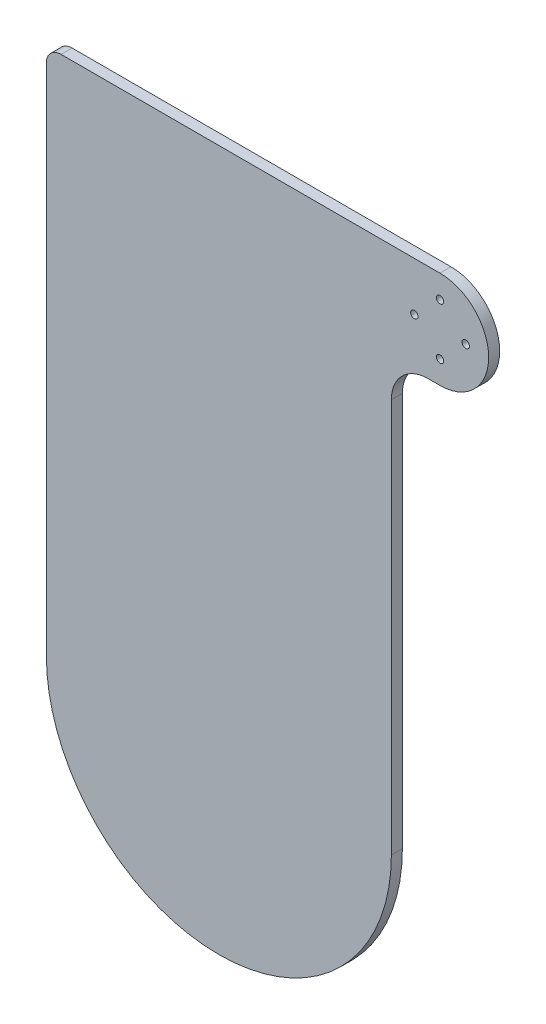
ISO-10303-21;
HEADER;
FILE_DESCRIPTION(('STEP AP214'),'2;1');
FILE_NAME('part.step','',(''),(''),'','','');
FILE_SCHEMA(('AUTOMOTIVE_DESIGN { 1 0 10303 214 1 1 1 1 }'));
ENDSEC;
DATA;
#1=APPLICATION_CONTEXT('core data for automotive mechanical design processes');
#2=APPLICATION_PROTOCOL_DEFINITION('international standard','automotive_design',2000,#1);
#3=PRODUCT_CONTEXT('',#1,'mechanical');
#4=PRODUCT('Part','Part','',(#3));
#5=PRODUCT_RELATED_PRODUCT_CATEGORY('part','',(#4));
#6=PRODUCT_DEFINITION_FORMATION('','',#4);
#7=PRODUCT_DEFINITION_CONTEXT('part definition',#1,'design');
#8=PRODUCT_DEFINITION('design','',#6,#7);
#9=PRODUCT_DEFINITION_SHAPE('','',#8);
#10=(LENGTH_UNIT() NAMED_UNIT(*) SI_UNIT(.MILLI.,.METRE.));
#11=(NAMED_UNIT(*) PLANE_ANGLE_UNIT() SI_UNIT($,.RADIAN.));
#12=(NAMED_UNIT(*) SI_UNIT($,.STERADIAN.) SOLID_ANGLE_UNIT());
#13=UNCERTAINTY_MEASURE_WITH_UNIT(LENGTH_MEASURE(1.E-05),#10,'distance_accuracy_value','');
#14=(GEOMETRIC_REPRESENTATION_CONTEXT(3) GLOBAL_UNCERTAINTY_ASSIGNED_CONTEXT((#13)) GLOBAL_UNIT_ASSIGNED_CONTEXT((#10,
#11,#12)) REPRESENTATION_CONTEXT('',''));
#15=CARTESIAN_POINT('',(0.,0.,0.));
#16=DIRECTION('',(0.,0.,1.));
#17=DIRECTION('',(1.,0.,0.));
#18=AXIS2_PLACEMENT_3D('',#15,#16,#17);
#19=CARTESIAN_POINT('',(-13.5687706879353,-43.6093853439674,3.));
#20=DIRECTION('',(0.,0.,-1.));
#21=DIRECTION('',(-1.,0.,0.));
#22=AXIS2_PLACEMENT_3D('',#19,#20,#21);
#23=CYLINDRICAL_SURFACE('',#22,47.);
#24=CARTESIAN_POINT('',(-13.5687706879353,-43.6093853439674,0.));
#25=DIRECTION('',(0.,0.,1.));
#26=DIRECTION('',(1.,0.,0.));
#27=AXIS2_PLACEMENT_3D('',#24,#25,#26);
#28=CIRCLE('',#27,47.);
#29=CARTESIAN_POINT('',(-60.5687706879353,-43.6093853439674,0.));
#30=VERTEX_POINT('',#29);
#31=CARTESIAN_POINT('',(33.4312293120647,-43.6093853439674,0.));
#32=VERTEX_POINT('',#31);
#33=EDGE_CURVE('E122',#30,#32,#28,.T.);
#34=ORIENTED_EDGE('',*,*,#33,.T.);
#35=DIRECTION('',(0.,0.,-1.));
#36=VECTOR('',#35,1.);
#37=CARTESIAN_POINT('',(33.4312293120647,-43.6093853439674,3.));
#38=LINE('',#37,#36);
#39=CARTESIAN_POINT('',(33.4312293120647,-43.6093853439674,3.));
#40=VERTEX_POINT('',#39);
#41=EDGE_CURVE('E103',#40,#32,#38,.T.);
#42=ORIENTED_EDGE('',*,*,#41,.F.);
#43=CARTESIAN_POINT('',(-13.5687706879353,-43.6093853439674,3.));
#44=DIRECTION('',(0.,0.,1.));
#45=DIRECTION('',(1.,0.,0.));
#46=AXIS2_PLACEMENT_3D('',#43,#44,#45);
#47=CIRCLE('',#46,47.);
#48=CARTESIAN_POINT('',(-60.5687706879353,-43.6093853439674,3.));
#49=VERTEX_POINT('',#48);
#50=EDGE_CURVE('E110',#49,#40,#47,.T.);
#51=ORIENTED_EDGE('',*,*,#50,.F.);
#52=DIRECTION('',(0.,0.,-1.));
#53=VECTOR('',#52,1.);
#54=CARTESIAN_POINT('',(-60.5687706879353,-43.6093853439674,3.));
#55=LINE('',#54,#53);
#56=EDGE_CURVE('E139',#49,#30,#55,.T.);
#57=ORIENTED_EDGE('',*,*,#56,.T.);
#58=EDGE_LOOP('',(#34,#42,#51,#57));
#59=FACE_BOUND('',#58,.T.);
#60=ADVANCED_FACE('F35',(#59),#23,.T.);
#61=CARTESIAN_POINT('',(33.4312293120647,-43.6093853439674,3.));
#62=DIRECTION('',(-1.,0.,0.));
#63=DIRECTION('',(0.,-1.,0.));
#64=AXIS2_PLACEMENT_3D('',#61,#62,#63);
#65=PLANE('',#64);
#66=DIRECTION('',(0.,1.,0.));
#67=VECTOR('',#66,1.);
#68=CARTESIAN_POINT('',(33.4312293120647,-43.6093853439674,0.));
#69=LINE('',#68,#67);
#70=CARTESIAN_POINT('',(33.4312293120647,63.7906146560326,0.));
#71=VERTEX_POINT('',#70);
#72=EDGE_CURVE('E151',#32,#71,#69,.T.);
#73=ORIENTED_EDGE('',*,*,#72,.T.);
#74=DIRECTION('',(0.,0.,-1.));
#75=VECTOR('',#74,1.);
#76=CARTESIAN_POINT('',(33.4312293120647,63.7906146560326,3.));
#77=LINE('',#76,#75);
#78=CARTESIAN_POINT('',(33.4312293120647,63.7906146560326,3.));
#79=VERTEX_POINT('',#78);
#80=EDGE_CURVE('E106',#79,#71,#77,.T.);
#81=ORIENTED_EDGE('',*,*,#80,.F.);
#82=DIRECTION('',(0.,1.,0.));
#83=VECTOR('',#82,1.);
#84=CARTESIAN_POINT('',(33.4312293120647,-43.6093853439674,3.));
#85=LINE('',#84,#83);
#86=EDGE_CURVE('E99',#40,#79,#85,.T.);
#87=ORIENTED_EDGE('',*,*,#86,.F.);
#88=ORIENTED_EDGE('',*,*,#41,.T.);
#89=EDGE_LOOP('',(#73,#81,#87,#88));
#90=FACE_BOUND('',#89,.T.);
#91=ADVANCED_FACE('F101',(#90),#65,.F.);
#92=CARTESIAN_POINT('',(43.4312293120647,63.7906146560326,3.));
#93=DIRECTION('',(0.,0.,-1.));
#94=DIRECTION('',(-1.,0.,0.));
#95=AXIS2_PLACEMENT_3D('',#92,#93,#94);
#96=CYLINDRICAL_SURFACE('',#95,9.99999999999999);
#97=CARTESIAN_POINT('',(43.4312293120647,63.7906146560326,0.));
#98=DIRECTION('',(0.,0.,-1.));
#99=DIRECTION('',(-1.,0.,0.));
#100=AXIS2_PLACEMENT_3D('',#97,#98,#99);
#101=CIRCLE('',#100,9.99999999999999);
#102=CARTESIAN_POINT('',(43.4312293120647,73.7906146560326,0.));
#103=VERTEX_POINT('',#102);
#104=EDGE_CURVE('E149',#71,#103,#101,.T.);
#105=ORIENTED_EDGE('',*,*,#104,.T.);
#106=DIRECTION('',(0.,0.,-1.));
#107=VECTOR('',#106,1.);
#108=CARTESIAN_POINT('',(43.4312293120647,73.7906146560326,3.));
#109=LINE('',#108,#107);
#110=CARTESIAN_POINT('',(43.4312293120647,73.7906146560326,3.));
#111=VERTEX_POINT('',#110);
#112=EDGE_CURVE('E127',#111,#103,#109,.T.);
#113=ORIENTED_EDGE('',*,*,#112,.F.);
#114=CARTESIAN_POINT('',(43.4312293120647,63.7906146560326,3.));
#115=DIRECTION('',(0.,0.,-1.));
#116=DIRECTION('',(-1.,0.,0.));
#117=AXIS2_PLACEMENT_3D('',#114,#115,#116);
#118=CIRCLE('',#117,9.99999999999999);
#119=EDGE_CURVE('E109',#79,#111,#118,.T.);
#120=ORIENTED_EDGE('',*,*,#119,.F.);
#121=ORIENTED_EDGE('',*,*,#80,.T.);
#122=EDGE_LOOP('',(#105,#113,#120,#121));
#123=FACE_BOUND('',#122,.T.);
#124=ADVANCED_FACE('F218',(#123),#96,.F.);
#125=CARTESIAN_POINT('',(46.6812293120647,73.7906146560326,3.));
#126=DIRECTION('',(0.,1.,0.));
#127=DIRECTION('',(0.,0.,1.));
#128=AXIS2_PLACEMENT_3D('',#125,#126,#127);
#129=PLANE('',#128);
#130=DIRECTION('',(1.,0.,0.));
#131=VECTOR('',#130,1.);
#132=CARTESIAN_POINT('',(46.6812293120647,73.7906146560326,0.));
#133=LINE('',#132,#131);
#134=CARTESIAN_POINT('',(46.6812293120647,73.7906146560326,0.));
#135=VERTEX_POINT('',#134);
#136=EDGE_CURVE('E147',#103,#135,#133,.T.);
#137=ORIENTED_EDGE('',*,*,#136,.T.);
#138=DIRECTION('',(0.,0.,-1.));
#139=VECTOR('',#138,1.);
#140=CARTESIAN_POINT('',(46.6812293120647,73.7906146560326,3.));
#141=LINE('',#140,#139);
#142=CARTESIAN_POINT('',(46.6812293120647,73.7906146560326,3.));
#143=VERTEX_POINT('',#142);
#144=EDGE_CURVE('E133',#143,#135,#141,.T.);
#145=ORIENTED_EDGE('',*,*,#144,.F.);
#146=DIRECTION('',(1.,0.,0.));
#147=VECTOR('',#146,1.);
#148=CARTESIAN_POINT('',(46.6812293120647,73.7906146560326,3.));
#149=LINE('',#148,#147);
#150=EDGE_CURVE('E160',#111,#143,#149,.T.);
#151=ORIENTED_EDGE('',*,*,#150,.F.);
#152=ORIENTED_EDGE('',*,*,#112,.T.);
#153=EDGE_LOOP('',(#137,#145,#151,#152));
#154=FACE_BOUND('',#153,.T.);
#155=ADVANCED_FACE('F214',(#154),#129,.F.);
#156=CARTESIAN_POINT('',(46.6812293120647,87.0406146560326,3.));
#157=DIRECTION('',(0.,0.,-1.));
#158=DIRECTION('',(-1.,0.,0.));
#159=AXIS2_PLACEMENT_3D('',#156,#157,#158);
#160=CYLINDRICAL_SURFACE('',#159,13.25);
#161=CARTESIAN_POINT('',(46.6812293120647,87.0406146560326,0.));
#162=DIRECTION('',(0.,0.,1.));
#163=DIRECTION('',(1.,0.,0.));
#164=AXIS2_PLACEMENT_3D('',#161,#162,#163);
#165=CIRCLE('',#164,13.25);
#166=CARTESIAN_POINT('',(46.6812293120647,100.290614656033,0.));
#167=VERTEX_POINT('',#166);
#168=EDGE_CURVE('E144',#135,#167,#165,.T.);
#169=ORIENTED_EDGE('',*,*,#168,.T.);
#170=DIRECTION('',(0.,0.,-1.));
#171=VECTOR('',#170,1.);
#172=CARTESIAN_POINT('',(46.6812293120647,100.290614656033,3.));
#173=LINE('',#172,#171);
#174=CARTESIAN_POINT('',(46.6812293120647,100.290614656033,3.));
#175=VERTEX_POINT('',#174);
#176=EDGE_CURVE('E136',#175,#167,#173,.T.);
#177=ORIENTED_EDGE('',*,*,#176,.F.);
#178=CARTESIAN_POINT('',(46.6812293120647,87.0406146560326,3.));
#179=DIRECTION('',(0.,0.,1.));
#180=DIRECTION('',(1.,0.,0.));
#181=AXIS2_PLACEMENT_3D('',#178,#179,#180);
#182=CIRCLE('',#181,13.25);
#183=EDGE_CURVE('E158',#143,#175,#182,.T.);
#184=ORIENTED_EDGE('',*,*,#183,.F.);
#185=ORIENTED_EDGE('',*,*,#144,.T.);
#186=EDGE_LOOP('',(#169,#177,#184,#185));
#187=FACE_BOUND('',#186,.T.);
#188=ADVANCED_FACE('F208',(#187),#160,.T.);
#189=CARTESIAN_POINT('',(33.4312293120647,100.290614656033,3.));
#190=DIRECTION('',(0.,-1.,0.));
#191=DIRECTION('',(0.,0.,-1.));
#192=AXIS2_PLACEMENT_3D('',#189,#190,#191);
#193=PLANE('',#192);
#194=DIRECTION('',(-1.,0.,0.));
#195=VECTOR('',#194,1.);
#196=CARTESIAN_POINT('',(33.4312293120647,100.290614656033,0.));
#197=LINE('',#196,#195);
#198=CARTESIAN_POINT('',(-56.5687706879353,100.290614656033,0.));
#199=VERTEX_POINT('',#198);
#200=EDGE_CURVE('E142',#167,#199,#197,.T.);
#201=ORIENTED_EDGE('',*,*,#200,.T.);
#202=DIRECTION('',(0.,0.,-1.));
#203=VECTOR('',#202,1.);
#204=CARTESIAN_POINT('',(-56.5687706879353,100.290614656033,3.));
#205=LINE('',#204,#203);
#206=CARTESIAN_POINT('',(-56.5687706879353,100.290614656032,3.));
#207=VERTEX_POINT('',#206);
#208=EDGE_CURVE('E43',#199,#207,#205,.F.);
#209=ORIENTED_EDGE('',*,*,#208,.T.);
#210=DIRECTION('',(-1.,0.,0.));
#211=VECTOR('',#210,1.);
#212=CARTESIAN_POINT('',(46.6812293120647,100.290614656033,3.));
#213=LINE('',#212,#211);
#214=EDGE_CURVE('E156',#175,#207,#213,.T.);
#215=ORIENTED_EDGE('',*,*,#214,.F.);
#216=ORIENTED_EDGE('',*,*,#176,.T.);
#217=EDGE_LOOP('',(#201,#209,#215,#216));
#218=FACE_BOUND('',#217,.T.);
#219=ADVANCED_FACE('F206',(#218),#193,.F.);
#220=CARTESIAN_POINT('',(-60.5687706879353,-43.6093853439674,3.));
#221=DIRECTION('',(1.,0.,0.));
#222=DIRECTION('',(0.,1.,0.));
#223=AXIS2_PLACEMENT_3D('',#220,#221,#222);
#224=PLANE('',#223);
#225=DIRECTION('',(0.,-1.,0.));
#226=VECTOR('',#225,1.);
#227=CARTESIAN_POINT('',(-60.5687706879353,-43.6093853439674,3.));
#228=LINE('',#227,#226);
#229=CARTESIAN_POINT('',(-60.5687706879353,96.2906146560326,3.));
#230=VERTEX_POINT('',#229);
#231=EDGE_CURVE('E115',#230,#49,#228,.T.);
#232=ORIENTED_EDGE('',*,*,#231,.F.);
#233=DIRECTION('',(0.,0.,-1.));
#234=VECTOR('',#233,1.);
#235=CARTESIAN_POINT('',(-60.5687706879353,96.2906146560326,3.));
#236=LINE('',#235,#234);
#237=CARTESIAN_POINT('',(-60.5687706879353,96.2906146560326,0.));
#238=VERTEX_POINT('',#237);
#239=EDGE_CURVE('E123',#230,#238,#236,.T.);
#240=ORIENTED_EDGE('',*,*,#239,.T.);
#241=DIRECTION('',(0.,-1.,0.));
#242=VECTOR('',#241,1.);
#243=CARTESIAN_POINT('',(-60.5687706879353,-43.6093853439674,0.));
#244=LINE('',#243,#242);
#245=EDGE_CURVE('E119',#238,#30,#244,.T.);
#246=ORIENTED_EDGE('',*,*,#245,.T.);
#247=ORIENTED_EDGE('',*,*,#56,.F.);
#248=EDGE_LOOP('',(#232,#240,#246,#247));
#249=FACE_BOUND('',#248,.T.);
#250=ADVANCED_FACE('F200',(#249),#224,.F.);
#251=CARTESIAN_POINT('',(-13.5687706879353,-43.6093853439674,3.));
#252=DIRECTION('',(0.,0.,1.));
#253=DIRECTION('',(1.,0.,0.));
#254=AXIS2_PLACEMENT_3D('',#251,#252,#253);
#255=PLANE('',#254);
#256=CARTESIAN_POINT('',(53.6812293120646,87.0406146560326,3.));
#257=DIRECTION('',(0.,0.,1.));
#258=DIRECTION('',(1.,0.,0.));
#259=AXIS2_PLACEMENT_3D('',#256,#257,#258);
#260=CIRCLE('',#259,0.999999999999998);
#261=CARTESIAN_POINT('',(54.6812293120646,87.0406146560326,3.));
#262=VERTEX_POINT('',#261);
#263=EDGE_CURVE('E180',#262,#262,#260,.T.);
#264=ORIENTED_EDGE('',*,*,#263,.F.);
#265=EDGE_LOOP('',(#264));
#266=FACE_BOUND('',#265,.T.);
#267=CARTESIAN_POINT('',(46.6812293120646,80.0406146560326,3.));
#268=DIRECTION('',(0.,0.,1.));
#269=DIRECTION('',(1.,0.,0.));
#270=AXIS2_PLACEMENT_3D('',#267,#268,#269);
#271=CIRCLE('',#270,0.999999999999998);
#272=CARTESIAN_POINT('',(47.6812293120646,80.0406146560326,3.));
#273=VERTEX_POINT('',#272);
#274=EDGE_CURVE('E174',#273,#273,#271,.T.);
#275=ORIENTED_EDGE('',*,*,#274,.F.);
#276=EDGE_LOOP('',(#275));
#277=FACE_BOUND('',#276,.T.);
#278=CARTESIAN_POINT('',(39.6812293120646,87.0406146560327,3.));
#279=DIRECTION('',(0.,0.,1.));
#280=DIRECTION('',(1.,0.,0.));
#281=AXIS2_PLACEMENT_3D('',#278,#279,#280);
#282=CIRCLE('',#281,0.999999999999998);
#283=CARTESIAN_POINT('',(40.6812293120646,87.0406146560327,3.));
#284=VERTEX_POINT('',#283);
#285=EDGE_CURVE('E168',#284,#284,#282,.T.);
#286=ORIENTED_EDGE('',*,*,#285,.F.);
#287=EDGE_LOOP('',(#286));
#288=FACE_BOUND('',#287,.T.);
#289=CARTESIAN_POINT('',(46.6812293120647,94.0406146560326,3.));
#290=DIRECTION('',(0.,0.,1.));
#291=DIRECTION('',(1.,0.,0.));
#292=AXIS2_PLACEMENT_3D('',#289,#290,#291);
#293=CIRCLE('',#292,0.999999999999998);
#294=CARTESIAN_POINT('',(47.6812293120647,94.0406146560326,3.));
#295=VERTEX_POINT('',#294);
#296=EDGE_CURVE('E154',#295,#295,#293,.T.);
#297=ORIENTED_EDGE('',*,*,#296,.F.);
#298=EDGE_LOOP('',(#297));
#299=FACE_BOUND('',#298,.T.);
#300=ORIENTED_EDGE('',*,*,#214,.T.);
#301=CARTESIAN_POINT('',(-56.5687706879353,96.2906146560326,3.));
#302=DIRECTION('',(0.,0.,1.));
#303=DIRECTION('',(1.,0.,0.));
#304=AXIS2_PLACEMENT_3D('',#301,#302,#303);
#305=CIRCLE('',#304,4.);
#306=EDGE_CURVE('E11',#207,#230,#305,.T.);
#307=ORIENTED_EDGE('',*,*,#306,.T.);
#308=ORIENTED_EDGE('',*,*,#231,.T.);
#309=ORIENTED_EDGE('',*,*,#50,.T.);
#310=ORIENTED_EDGE('',*,*,#86,.T.);
#311=ORIENTED_EDGE('',*,*,#119,.T.);
#312=ORIENTED_EDGE('',*,*,#150,.T.);
#313=ORIENTED_EDGE('',*,*,#183,.T.);
#314=EDGE_LOOP('',(#300,#307,#308,#309,#310,#311,#312,#313));
#315=FACE_BOUND('',#314,.T.);
#316=ADVANCED_FACE('F113',(#266,#277,#288,#299,#315),#255,.T.);
#317=CARTESIAN_POINT('',(-13.5687706879353,-43.6093853439674,0.));
#318=DIRECTION('',(0.,0.,1.));
#319=DIRECTION('',(1.,0.,0.));
#320=AXIS2_PLACEMENT_3D('',#317,#318,#319);
#321=PLANE('',#320);
#322=CARTESIAN_POINT('',(53.6812293120646,87.0406146560326,0.));
#323=DIRECTION('',(0.,0.,-1.));
#324=DIRECTION('',(-1.,0.,0.));
#325=AXIS2_PLACEMENT_3D('',#322,#323,#324);
#326=CIRCLE('',#325,0.999999999999998);
#327=CARTESIAN_POINT('',(52.6812293120646,87.0406146560326,0.));
#328=VERTEX_POINT('',#327);
#329=EDGE_CURVE('E183',#328,#328,#326,.T.);
#330=ORIENTED_EDGE('',*,*,#329,.F.);
#331=EDGE_LOOP('',(#330));
#332=FACE_BOUND('',#331,.T.);
#333=CARTESIAN_POINT('',(46.6812293120646,80.0406146560326,0.));
#334=DIRECTION('',(0.,0.,-1.));
#335=DIRECTION('',(-1.,0.,0.));
#336=AXIS2_PLACEMENT_3D('',#333,#334,#335);
#337=CIRCLE('',#336,0.999999999999998);
#338=CARTESIAN_POINT('',(45.6812293120646,80.0406146560326,0.));
#339=VERTEX_POINT('',#338);
#340=EDGE_CURVE('E177',#339,#339,#337,.T.);
#341=ORIENTED_EDGE('',*,*,#340,.F.);
#342=EDGE_LOOP('',(#341));
#343=FACE_BOUND('',#342,.T.);
#344=CARTESIAN_POINT('',(39.6812293120646,87.0406146560327,0.));
#345=DIRECTION('',(0.,0.,-1.));
#346=DIRECTION('',(-1.,0.,0.));
#347=AXIS2_PLACEMENT_3D('',#344,#345,#346);
#348=CIRCLE('',#347,0.999999999999998);
#349=CARTESIAN_POINT('',(38.6812293120646,87.0406146560327,0.));
#350=VERTEX_POINT('',#349);
#351=EDGE_CURVE('E171',#350,#350,#348,.T.);
#352=ORIENTED_EDGE('',*,*,#351,.F.);
#353=EDGE_LOOP('',(#352));
#354=FACE_BOUND('',#353,.T.);
#355=CARTESIAN_POINT('',(46.6812293120647,94.0406146560326,0.));
#356=DIRECTION('',(0.,0.,-1.));
#357=DIRECTION('',(-1.,0.,0.));
#358=AXIS2_PLACEMENT_3D('',#355,#356,#357);
#359=CIRCLE('',#358,0.999999999999998);
#360=CARTESIAN_POINT('',(45.6812293120647,94.0406146560326,0.));
#361=VERTEX_POINT('',#360);
#362=EDGE_CURVE('E165',#361,#361,#359,.T.);
#363=ORIENTED_EDGE('',*,*,#362,.F.);
#364=EDGE_LOOP('',(#363));
#365=FACE_BOUND('',#364,.T.);
#366=ORIENTED_EDGE('',*,*,#245,.F.);
#367=CARTESIAN_POINT('',(-56.5687706879353,96.2906146560326,0.));
#368=DIRECTION('',(0.,0.,1.));
#369=DIRECTION('',(1.,0.,0.));
#370=AXIS2_PLACEMENT_3D('',#367,#368,#369);
#371=CIRCLE('',#370,4.);
#372=EDGE_CURVE('E57',#238,#199,#371,.F.);
#373=ORIENTED_EDGE('',*,*,#372,.T.);
#374=ORIENTED_EDGE('',*,*,#200,.F.);
#375=ORIENTED_EDGE('',*,*,#168,.F.);
#376=ORIENTED_EDGE('',*,*,#136,.F.);
#377=ORIENTED_EDGE('',*,*,#104,.F.);
#378=ORIENTED_EDGE('',*,*,#72,.F.);
#379=ORIENTED_EDGE('',*,*,#33,.F.);
#380=EDGE_LOOP('',(#366,#373,#374,#375,#376,#377,#378,#379));
#381=FACE_BOUND('',#380,.T.);
#382=ADVANCED_FACE('F189',(#332,#343,#354,#365,#381),#321,.F.);
#383=CARTESIAN_POINT('',(46.6812293120647,94.0406146560326,10.));
#384=DIRECTION('',(0.,0.,-1.));
#385=DIRECTION('',(-1.,0.,0.));
#386=AXIS2_PLACEMENT_3D('',#383,#384,#385);
#387=CYLINDRICAL_SURFACE('',#386,0.999999999999998);
#388=ORIENTED_EDGE('',*,*,#296,.T.);
#389=EDGE_LOOP('',(#388));
#390=FACE_BOUND('',#389,.T.);
#391=ORIENTED_EDGE('',*,*,#362,.T.);
#392=EDGE_LOOP('',(#391));
#393=FACE_BOUND('',#392,.T.);
#394=ADVANCED_FACE('F192',(#390,#393),#387,.F.);
#395=CARTESIAN_POINT('',(39.6812293120646,87.0406146560327,10.));
#396=DIRECTION('',(0.,0.,-1.));
#397=DIRECTION('',(-1.,0.,0.));
#398=AXIS2_PLACEMENT_3D('',#395,#396,#397);
#399=CYLINDRICAL_SURFACE('',#398,0.999999999999998);
#400=ORIENTED_EDGE('',*,*,#285,.T.);
#401=EDGE_LOOP('',(#400));
#402=FACE_BOUND('',#401,.T.);
#403=ORIENTED_EDGE('',*,*,#351,.T.);
#404=EDGE_LOOP('',(#403));
#405=FACE_BOUND('',#404,.T.);
#406=ADVANCED_FACE('F263',(#402,#405),#399,.F.);
#407=CARTESIAN_POINT('',(46.6812293120646,80.0406146560326,10.));
#408=DIRECTION('',(0.,0.,-1.));
#409=DIRECTION('',(-1.,0.,0.));
#410=AXIS2_PLACEMENT_3D('',#407,#408,#409);
#411=CYLINDRICAL_SURFACE('',#410,0.999999999999998);
#412=ORIENTED_EDGE('',*,*,#274,.T.);
#413=EDGE_LOOP('',(#412));
#414=FACE_BOUND('',#413,.T.);
#415=ORIENTED_EDGE('',*,*,#340,.T.);
#416=EDGE_LOOP('',(#415));
#417=FACE_BOUND('',#416,.T.);
#418=ADVANCED_FACE('F275',(#414,#417),#411,.F.);
#419=CARTESIAN_POINT('',(53.6812293120646,87.0406146560326,10.));
#420=DIRECTION('',(0.,0.,-1.));
#421=DIRECTION('',(-1.,0.,0.));
#422=AXIS2_PLACEMENT_3D('',#419,#420,#421);
#423=CYLINDRICAL_SURFACE('',#422,0.999999999999998);
#424=ORIENTED_EDGE('',*,*,#263,.T.);
#425=EDGE_LOOP('',(#424));
#426=FACE_BOUND('',#425,.T.);
#427=ORIENTED_EDGE('',*,*,#329,.T.);
#428=EDGE_LOOP('',(#427));
#429=FACE_BOUND('',#428,.T.);
#430=ADVANCED_FACE('F187',(#426,#429),#423,.F.);
#431=CARTESIAN_POINT('',(-56.5687706879353,96.2906146560326,3.));
#432=DIRECTION('',(0.,0.,-1.));
#433=DIRECTION('',(-1.,0.,0.));
#434=AXIS2_PLACEMENT_3D('',#431,#432,#433);
#435=CYLINDRICAL_SURFACE('',#434,4.);
#436=ORIENTED_EDGE('',*,*,#306,.F.);
#437=ORIENTED_EDGE('',*,*,#208,.F.);
#438=ORIENTED_EDGE('',*,*,#372,.F.);
#439=ORIENTED_EDGE('',*,*,#239,.F.);
#440=EDGE_LOOP('',(#436,#437,#438,#439));
#441=FACE_BOUND('',#440,.T.);
#442=ADVANCED_FACE('F37',(#441),#435,.T.);
#443=CLOSED_SHELL('',(#60,#91,#124,#155,#188,#219,#250,#316,#382,#394,#406,#418,#430,#442));
#444=MANIFOLD_SOLID_BREP('B2',#443);
#445=ADVANCED_BREP_SHAPE_REPRESENTATION('',(#18,#444),#14);
#446=SHAPE_DEFINITION_REPRESENTATION(#9,#445);
ENDSEC;
END-ISO-10303-21;
